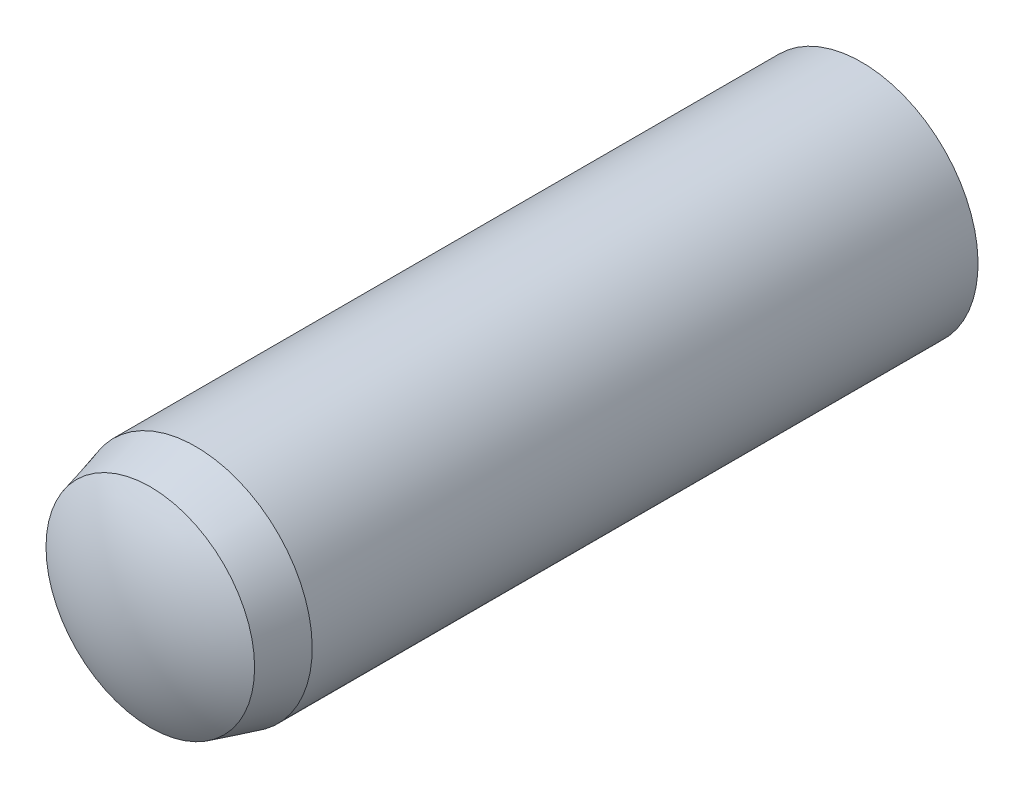
ISO-10303-21;
HEADER;
FILE_DESCRIPTION(('STEP AP214'),'2;1');
FILE_NAME('part.step','',(''),(''),'','','');
FILE_SCHEMA(('AUTOMOTIVE_DESIGN { 1 0 10303 214 1 1 1 1 }'));
ENDSEC;
DATA;
#1=APPLICATION_CONTEXT('core data for automotive mechanical design processes');
#2=APPLICATION_PROTOCOL_DEFINITION('international standard','automotive_design',2000,#1);
#3=PRODUCT_CONTEXT('',#1,'mechanical');
#4=PRODUCT('Part','Part','',(#3));
#5=PRODUCT_RELATED_PRODUCT_CATEGORY('part','',(#4));
#6=PRODUCT_DEFINITION_FORMATION('','',#4);
#7=PRODUCT_DEFINITION_CONTEXT('part definition',#1,'design');
#8=PRODUCT_DEFINITION('design','',#6,#7);
#9=PRODUCT_DEFINITION_SHAPE('','',#8);
#10=(LENGTH_UNIT() NAMED_UNIT(*) SI_UNIT(.MILLI.,.METRE.));
#11=(NAMED_UNIT(*) PLANE_ANGLE_UNIT() SI_UNIT($,.RADIAN.));
#12=(NAMED_UNIT(*) SI_UNIT($,.STERADIAN.) SOLID_ANGLE_UNIT());
#13=UNCERTAINTY_MEASURE_WITH_UNIT(LENGTH_MEASURE(1.E-05),#10,'distance_accuracy_value','');
#14=(GEOMETRIC_REPRESENTATION_CONTEXT(3) GLOBAL_UNCERTAINTY_ASSIGNED_CONTEXT((#13)) GLOBAL_UNIT_ASSIGNED_CONTEXT((#10,
#11,#12)) REPRESENTATION_CONTEXT('',''));
#15=CARTESIAN_POINT('',(0.,0.,0.));
#16=DIRECTION('',(0.,0.,1.));
#17=DIRECTION('',(1.,0.,0.));
#18=AXIS2_PLACEMENT_3D('',#15,#16,#17);
#19=CARTESIAN_POINT('',(0.,0.,-2.27500000000002));
#20=DIRECTION('',(0.,0.,1.));
#21=DIRECTION('',(0.,-1.,0.));
#22=AXIS2_PLACEMENT_3D('',#19,#20,#21);
#23=SPHERICAL_SURFACE('',#22,2.72499999999999);
#24=CARTESIAN_POINT('',(0.,0.,-4.55));
#25=DIRECTION('',(0.,0.,1.));
#26=DIRECTION('',(0.,-1.,0.));
#27=AXIS2_PLACEMENT_3D('',#24,#25,#26);
#28=CIRCLE('',#27,1.5);
#29=CARTESIAN_POINT('',(0.,-1.5,-4.55));
#30=VERTEX_POINT('',#29);
#31=EDGE_CURVE('E10',#30,#30,#28,.T.);
#32=ORIENTED_EDGE('',*,*,#31,.F.);
#33=EDGE_LOOP('',(#32));
#34=FACE_BOUND('',#33,.T.);
#35=ADVANCED_FACE('F30',(#34),#23,.T.);
#36=CARTESIAN_POINT('',(0.,0.,5.));
#37=DIRECTION('',(0.,0.,1.));
#38=DIRECTION('',(0.,-1.,0.));
#39=AXIS2_PLACEMENT_3D('',#36,#37,#38);
#40=CYLINDRICAL_SURFACE('',#39,1.5);
#41=CARTESIAN_POINT('',(0.,0.,4.025));
#42=DIRECTION('',(0.,0.,1.));
#43=DIRECTION('',(0.,-1.,0.));
#44=AXIS2_PLACEMENT_3D('',#41,#42,#43);
#45=CIRCLE('',#44,1.5);
#46=CARTESIAN_POINT('',(0.,-1.5,4.025));
#47=VERTEX_POINT('',#46);
#48=EDGE_CURVE('E36',#47,#47,#45,.T.);
#49=ORIENTED_EDGE('',*,*,#48,.F.);
#50=EDGE_LOOP('',(#49));
#51=FACE_BOUND('',#50,.T.);
#52=ORIENTED_EDGE('',*,*,#31,.T.);
#53=EDGE_LOOP('',(#52));
#54=FACE_BOUND('',#53,.T.);
#55=ADVANCED_FACE('F51',(#51,#54),#40,.T.);
#56=CARTESIAN_POINT('',(0.,0.,4.025));
#57=DIRECTION('',(0.,0.,-1.));
#58=DIRECTION('',(0.,1.,0.));
#59=AXIS2_PLACEMENT_3D('',#56,#57,#58);
#60=CONICAL_SURFACE('',#59,1.5,0.261799387799149);
#61=CARTESIAN_POINT('',(0.,0.,4.61));
#62=DIRECTION('',(0.,0.,1.));
#63=DIRECTION('',(0.,-1.,0.));
#64=AXIS2_PLACEMENT_3D('',#61,#62,#63);
#65=CIRCLE('',#64,1.34324972242779);
#66=CARTESIAN_POINT('',(0.,-1.34324972242779,4.61));
#67=VERTEX_POINT('',#66);
#68=EDGE_CURVE('E40',#67,#67,#65,.T.);
#69=ORIENTED_EDGE('',*,*,#68,.F.);
#70=EDGE_LOOP('',(#69));
#71=FACE_BOUND('',#70,.T.);
#72=ORIENTED_EDGE('',*,*,#48,.T.);
#73=EDGE_LOOP('',(#72));
#74=FACE_BOUND('',#73,.T.);
#75=ADVANCED_FACE('F49',(#71,#74),#60,.T.);
#76=CARTESIAN_POINT('',(0.,0.,2.49176946563803));
#77=DIRECTION('',(0.,0.,1.));
#78=DIRECTION('',(0.,1.,0.));
#79=AXIS2_PLACEMENT_3D('',#76,#77,#78);
#80=SPHERICAL_SURFACE('',#79,2.50823053436198);
#81=ORIENTED_EDGE('',*,*,#68,.T.);
#82=EDGE_LOOP('',(#81));
#83=FACE_BOUND('',#82,.T.);
#84=ADVANCED_FACE('F47',(#83),#80,.T.);
#85=CLOSED_SHELL('',(#35,#55,#75,#84));
#86=MANIFOLD_SOLID_BREP('B2',#85);
#87=ADVANCED_BREP_SHAPE_REPRESENTATION('',(#18,#86),#14);
#88=SHAPE_DEFINITION_REPRESENTATION(#9,#87);
ENDSEC;
END-ISO-10303-21;
